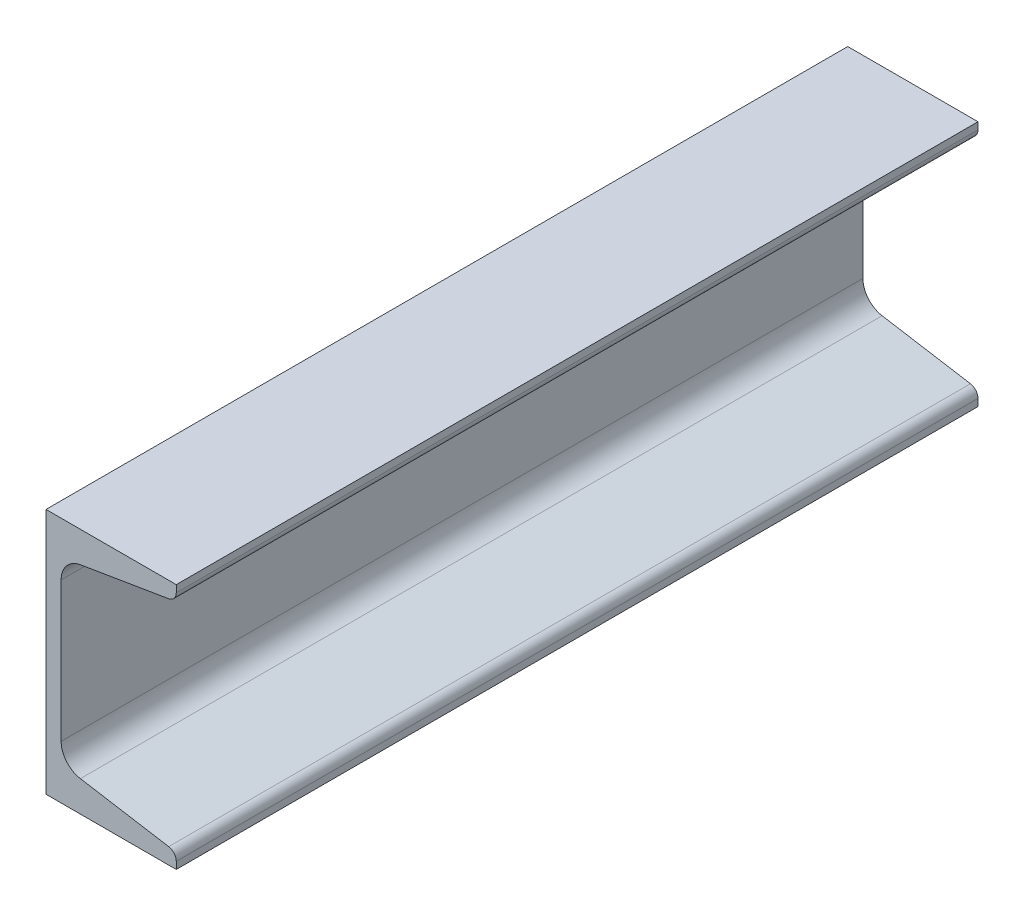
ISO-10303-21;
HEADER;
FILE_DESCRIPTION(('STEP AP214'),'2;1');
FILE_NAME('part.step','',(''),(''),'','','');
FILE_SCHEMA(('AUTOMOTIVE_DESIGN { 1 0 10303 214 1 1 1 1 }'));
ENDSEC;
DATA;
#1=APPLICATION_CONTEXT('core data for automotive mechanical design processes');
#2=APPLICATION_PROTOCOL_DEFINITION('international standard','automotive_design',2000,#1);
#3=PRODUCT_CONTEXT('',#1,'mechanical');
#4=PRODUCT('Part','Part','',(#3));
#5=PRODUCT_RELATED_PRODUCT_CATEGORY('part','',(#4));
#6=PRODUCT_DEFINITION_FORMATION('','',#4);
#7=PRODUCT_DEFINITION_CONTEXT('part definition',#1,'design');
#8=PRODUCT_DEFINITION('design','',#6,#7);
#9=PRODUCT_DEFINITION_SHAPE('','',#8);
#10=(LENGTH_UNIT() NAMED_UNIT(*) SI_UNIT(.MILLI.,.METRE.));
#11=(NAMED_UNIT(*) PLANE_ANGLE_UNIT() SI_UNIT($,.RADIAN.));
#12=(NAMED_UNIT(*) SI_UNIT($,.STERADIAN.) SOLID_ANGLE_UNIT());
#13=UNCERTAINTY_MEASURE_WITH_UNIT(LENGTH_MEASURE(1.E-05),#10,'distance_accuracy_value','');
#14=(GEOMETRIC_REPRESENTATION_CONTEXT(3) GLOBAL_UNCERTAINTY_ASSIGNED_CONTEXT((#13)) GLOBAL_UNIT_ASSIGNED_CONTEXT((#10,
#11,#12)) REPRESENTATION_CONTEXT('',''));
#15=CARTESIAN_POINT('',(0.,0.,0.));
#16=DIRECTION('',(0.,0.,1.));
#17=DIRECTION('',(1.,0.,0.));
#18=AXIS2_PLACEMENT_3D('',#15,#16,#17);
#19=CARTESIAN_POINT('',(0.,0.,247.65));
#20=DIRECTION('',(0.,1.,0.));
#21=DIRECTION('',(0.,0.,1.));
#22=AXIS2_PLACEMENT_3D('',#19,#20,#21);
#23=PLANE('',#22);
#24=DIRECTION('',(1.,0.,0.));
#25=VECTOR('',#24,1.);
#26=CARTESIAN_POINT('',(0.,0.,0.));
#27=LINE('',#26,#25);
#28=CARTESIAN_POINT('',(0.,0.,0.));
#29=VERTEX_POINT('',#28);
#30=CARTESIAN_POINT('',(40.2336,0.,0.));
#31=VERTEX_POINT('',#30);
#32=EDGE_CURVE('E156',#29,#31,#27,.T.);
#33=ORIENTED_EDGE('',*,*,#32,.T.);
#34=DIRECTION('',(0.,0.,-1.));
#35=VECTOR('',#34,1.);
#36=CARTESIAN_POINT('',(40.2336,0.,247.65));
#37=LINE('',#36,#35);
#38=CARTESIAN_POINT('',(40.2336,0.,247.65));
#39=VERTEX_POINT('',#38);
#40=EDGE_CURVE('E11',#39,#31,#37,.T.);
#41=ORIENTED_EDGE('',*,*,#40,.F.);
#42=DIRECTION('',(1.,0.,0.));
#43=VECTOR('',#42,1.);
#44=CARTESIAN_POINT('',(0.,0.,247.65));
#45=LINE('',#44,#43);
#46=CARTESIAN_POINT('',(0.,0.,247.65));
#47=VERTEX_POINT('',#46);
#48=EDGE_CURVE('E186',#47,#39,#45,.T.);
#49=ORIENTED_EDGE('',*,*,#48,.F.);
#50=DIRECTION('',(0.,0.,-1.));
#51=VECTOR('',#50,1.);
#52=CARTESIAN_POINT('',(0.,0.,247.65));
#53=LINE('',#52,#51);
#54=EDGE_CURVE('E52',#47,#29,#53,.T.);
#55=ORIENTED_EDGE('',*,*,#54,.T.);
#56=EDGE_LOOP('',(#33,#41,#49,#55));
#57=FACE_BOUND('',#56,.T.);
#58=ADVANCED_FACE('F36',(#57),#23,.F.);
#59=CARTESIAN_POINT('',(40.2336,0.,247.65));
#60=DIRECTION('',(-1.,0.,0.));
#61=DIRECTION('',(0.,0.,1.));
#62=AXIS2_PLACEMENT_3D('',#59,#60,#61);
#63=PLANE('',#62);
#64=DIRECTION('',(0.,1.,0.));
#65=VECTOR('',#64,1.);
#66=CARTESIAN_POINT('',(40.2336,0.,0.));
#67=LINE('',#66,#65);
#68=CARTESIAN_POINT('',(40.2336,2.18800579212265,0.));
#69=VERTEX_POINT('',#68);
#70=EDGE_CURVE('E158',#31,#69,#67,.T.);
#71=ORIENTED_EDGE('',*,*,#70,.T.);
#72=DIRECTION('',(0.,0.,-1.));
#73=VECTOR('',#72,1.);
#74=CARTESIAN_POINT('',(40.2336,2.18800579212265,247.65));
#75=LINE('',#74,#73);
#76=CARTESIAN_POINT('',(40.2336,2.18800579212265,247.65));
#77=VERTEX_POINT('',#76);
#78=EDGE_CURVE('E44',#77,#69,#75,.T.);
#79=ORIENTED_EDGE('',*,*,#78,.F.);
#80=DIRECTION('',(0.,1.,0.));
#81=VECTOR('',#80,1.);
#82=CARTESIAN_POINT('',(40.2336,0.,247.65));
#83=LINE('',#82,#81);
#84=EDGE_CURVE('E102',#39,#77,#83,.T.);
#85=ORIENTED_EDGE('',*,*,#84,.F.);
#86=ORIENTED_EDGE('',*,*,#40,.T.);
#87=EDGE_LOOP('',(#71,#79,#85,#86));
#88=FACE_BOUND('',#87,.T.);
#89=ADVANCED_FACE('F248',(#88),#63,.F.);
#90=CARTESIAN_POINT('',(37.4396,2.18800579212265,247.65));
#91=DIRECTION('',(0.,0.,-1.));
#92=DIRECTION('',(-1.,0.,0.));
#93=AXIS2_PLACEMENT_3D('',#90,#91,#92);
#94=CYLINDRICAL_SURFACE('',#93,2.79400000000003);
#95=CARTESIAN_POINT('',(37.4396,2.18800579212265,0.));
#96=DIRECTION('',(0.,0.,1.));
#97=DIRECTION('',(1.,0.,0.));
#98=AXIS2_PLACEMENT_3D('',#95,#96,#97);
#99=CIRCLE('',#98,2.79400000000003);
#100=CARTESIAN_POINT('',(37.8989633729746,4.94398498137094,0.));
#101=VERTEX_POINT('',#100);
#102=EDGE_CURVE('E160',#69,#101,#99,.T.);
#103=ORIENTED_EDGE('',*,*,#102,.T.);
#104=DIRECTION('',(0.,0.,-1.));
#105=VECTOR('',#104,1.);
#106=CARTESIAN_POINT('',(37.8989633729746,4.94398498137094,247.65));
#107=LINE('',#106,#105);
#108=CARTESIAN_POINT('',(37.8989633729746,4.94398498137094,247.65));
#109=VERTEX_POINT('',#108);
#110=EDGE_CURVE('E201',#109,#101,#107,.T.);
#111=ORIENTED_EDGE('',*,*,#110,.F.);
#112=CARTESIAN_POINT('',(37.4396,2.18800579212265,247.65));
#113=DIRECTION('',(0.,0.,1.));
#114=DIRECTION('',(1.,0.,0.));
#115=AXIS2_PLACEMENT_3D('',#112,#113,#114);
#116=CIRCLE('',#115,2.79400000000003);
#117=EDGE_CURVE('E208',#77,#109,#116,.T.);
#118=ORIENTED_EDGE('',*,*,#117,.F.);
#119=ORIENTED_EDGE('',*,*,#78,.T.);
#120=EDGE_LOOP('',(#103,#111,#118,#119));
#121=FACE_BOUND('',#120,.T.);
#122=ADVANCED_FACE('F206',(#121),#94,.T.);
#123=CARTESIAN_POINT('',(10.616311414246,9.49142535260086,247.65));
#124=DIRECTION('',(0.164410656039627,0.986391978972163,0.));
#125=DIRECTION('',(-0.986391978972163,0.164410656039627,0.));
#126=AXIS2_PLACEMENT_3D('',#123,#124,#125);
#127=PLANE('',#126);
#128=DIRECTION('',(0.986391978972163,-0.164410656039627,0.));
#129=VECTOR('',#128,1.);
#130=CARTESIAN_POINT('',(10.616311414246,9.49142535260086,0.));
#131=LINE('',#130,#129);
#132=CARTESIAN_POINT('',(10.616311414246,9.49142535260087,0.));
#133=VERTEX_POINT('',#132);
#134=EDGE_CURVE('E163',#133,#101,#131,.T.);
#135=ORIENTED_EDGE('',*,*,#134,.F.);
#136=DIRECTION('',(0.,0.,-1.));
#137=VECTOR('',#136,1.);
#138=CARTESIAN_POINT('',(10.616311414246,9.49142535260087,247.65));
#139=LINE('',#138,#137);
#140=CARTESIAN_POINT('',(10.616311414246,9.49142535260087,247.65));
#141=VERTEX_POINT('',#140);
#142=EDGE_CURVE('E199',#141,#133,#139,.T.);
#143=ORIENTED_EDGE('',*,*,#142,.F.);
#144=DIRECTION('',(0.986391978972163,-0.164410656039627,0.));
#145=VECTOR('',#144,1.);
#146=CARTESIAN_POINT('',(10.616311414246,9.49142535260086,247.65));
#147=LINE('',#146,#145);
#148=EDGE_CURVE('E217',#141,#109,#147,.T.);
#149=ORIENTED_EDGE('',*,*,#148,.T.);
#150=ORIENTED_EDGE('',*,*,#110,.T.);
#151=EDGE_LOOP('',(#135,#143,#149,#150));
#152=FACE_BOUND('',#151,.T.);
#153=ADVANCED_FACE('F214',(#152),#127,.T.);
#154=CARTESIAN_POINT('',(11.7856,16.5066451070509,247.65));
#155=DIRECTION('',(0.,0.,-1.));
#156=DIRECTION('',(-1.,0.,0.));
#157=AXIS2_PLACEMENT_3D('',#154,#155,#156);
#158=CYLINDRICAL_SURFACE('',#157,7.11200000000001);
#159=CARTESIAN_POINT('',(11.7856,16.5066451070509,0.));
#160=DIRECTION('',(0.,0.,1.));
#161=DIRECTION('',(1.,0.,0.));
#162=AXIS2_PLACEMENT_3D('',#159,#160,#161);
#163=CIRCLE('',#162,7.11200000000001);
#164=CARTESIAN_POINT('',(4.6736,16.5066451070509,0.));
#165=VERTEX_POINT('',#164);
#166=EDGE_CURVE('E166',#165,#133,#163,.T.);
#167=ORIENTED_EDGE('',*,*,#166,.F.);
#168=DIRECTION('',(0.,0.,-1.));
#169=VECTOR('',#168,1.);
#170=CARTESIAN_POINT('',(4.6736,16.5066451070509,247.65));
#171=LINE('',#170,#169);
#172=CARTESIAN_POINT('',(4.6736,16.5066451070509,247.65));
#173=VERTEX_POINT('',#172);
#174=EDGE_CURVE('E197',#173,#165,#171,.T.);
#175=ORIENTED_EDGE('',*,*,#174,.F.);
#176=CARTESIAN_POINT('',(11.7856,16.5066451070509,247.65));
#177=DIRECTION('',(0.,0.,1.));
#178=DIRECTION('',(1.,0.,0.));
#179=AXIS2_PLACEMENT_3D('',#176,#177,#178);
#180=CIRCLE('',#179,7.11200000000001);
#181=EDGE_CURVE('E220',#173,#141,#180,.T.);
#182=ORIENTED_EDGE('',*,*,#181,.T.);
#183=ORIENTED_EDGE('',*,*,#142,.T.);
#184=EDGE_LOOP('',(#167,#175,#182,#183));
#185=FACE_BOUND('',#184,.T.);
#186=ADVANCED_FACE('F261',(#185),#158,.F.);
#187=CARTESIAN_POINT('',(4.67360000000015,59.6933548929492,247.65));
#188=DIRECTION('',(1.,0.,0.));
#189=DIRECTION('',(0.,1.,0.));
#190=AXIS2_PLACEMENT_3D('',#187,#188,#189);
#191=PLANE('',#190);
#192=DIRECTION('',(0.,-1.,0.));
#193=VECTOR('',#192,1.);
#194=CARTESIAN_POINT('',(4.67360000000015,59.6933548929492,0.));
#195=LINE('',#194,#193);
#196=CARTESIAN_POINT('',(4.67360000000019,59.6933548929492,0.));
#197=VERTEX_POINT('',#196);
#198=EDGE_CURVE('E169',#197,#165,#195,.T.);
#199=ORIENTED_EDGE('',*,*,#198,.F.);
#200=DIRECTION('',(0.,0.,-1.));
#201=VECTOR('',#200,1.);
#202=CARTESIAN_POINT('',(4.67360000000019,59.6933548929492,247.65));
#203=LINE('',#202,#201);
#204=CARTESIAN_POINT('',(4.67360000000019,59.6933548929492,247.65));
#205=VERTEX_POINT('',#204);
#206=EDGE_CURVE('E195',#205,#197,#203,.T.);
#207=ORIENTED_EDGE('',*,*,#206,.F.);
#208=DIRECTION('',(0.,-1.,0.));
#209=VECTOR('',#208,1.);
#210=CARTESIAN_POINT('',(4.67360000000015,59.6933548929492,247.65));
#211=LINE('',#210,#209);
#212=EDGE_CURVE('E222',#205,#173,#211,.T.);
#213=ORIENTED_EDGE('',*,*,#212,.T.);
#214=ORIENTED_EDGE('',*,*,#174,.T.);
#215=EDGE_LOOP('',(#199,#207,#213,#214));
#216=FACE_BOUND('',#215,.T.);
#217=ADVANCED_FACE('F264',(#216),#191,.T.);
#218=CARTESIAN_POINT('',(11.7856000000002,59.6933548929492,247.65));
#219=DIRECTION('',(0.,0.,-1.));
#220=DIRECTION('',(-1.,0.,0.));
#221=AXIS2_PLACEMENT_3D('',#218,#219,#220);
#222=CYLINDRICAL_SURFACE('',#221,7.11199999999998);
#223=CARTESIAN_POINT('',(11.7856000000002,59.6933548929492,0.));
#224=DIRECTION('',(0.,0.,-1.));
#225=DIRECTION('',(-1.,0.,0.));
#226=AXIS2_PLACEMENT_3D('',#223,#224,#225);
#227=CIRCLE('',#226,7.11199999999998);
#228=CARTESIAN_POINT('',(10.6163114142463,66.7085746473992,0.));
#229=VERTEX_POINT('',#228);
#230=EDGE_CURVE('E172',#197,#229,#227,.T.);
#231=ORIENTED_EDGE('',*,*,#230,.T.);
#232=DIRECTION('',(0.,0.,-1.));
#233=VECTOR('',#232,1.);
#234=CARTESIAN_POINT('',(10.6163114142463,66.7085746473992,247.65));
#235=LINE('',#234,#233);
#236=CARTESIAN_POINT('',(10.6163114142463,66.7085746473992,247.65));
#237=VERTEX_POINT('',#236);
#238=EDGE_CURVE('E192',#237,#229,#235,.T.);
#239=ORIENTED_EDGE('',*,*,#238,.F.);
#240=CARTESIAN_POINT('',(11.7856000000002,59.6933548929492,247.65));
#241=DIRECTION('',(0.,0.,-1.));
#242=DIRECTION('',(-1.,0.,0.));
#243=AXIS2_PLACEMENT_3D('',#240,#241,#242);
#244=CIRCLE('',#243,7.11199999999998);
#245=EDGE_CURVE('E229',#205,#237,#244,.T.);
#246=ORIENTED_EDGE('',*,*,#245,.F.);
#247=ORIENTED_EDGE('',*,*,#206,.T.);
#248=EDGE_LOOP('',(#231,#239,#246,#247));
#249=FACE_BOUND('',#248,.T.);
#250=ADVANCED_FACE('F268',(#249),#222,.F.);
#251=CARTESIAN_POINT('',(10.6163114142463,66.7085746473992,247.65));
#252=DIRECTION('',(-0.164410656039622,0.986391978972163,0.));
#253=DIRECTION('',(-0.986391978972164,-0.164410656039622,0.));
#254=AXIS2_PLACEMENT_3D('',#251,#252,#253);
#255=PLANE('',#254);
#256=DIRECTION('',(0.986391978972164,0.164410656039622,0.));
#257=VECTOR('',#256,1.);
#258=CARTESIAN_POINT('',(10.6163114142463,66.7085746473992,0.));
#259=LINE('',#258,#257);
#260=CARTESIAN_POINT('',(37.8989633729749,71.2560150186291,0.));
#261=VERTEX_POINT('',#260);
#262=EDGE_CURVE('E174',#229,#261,#259,.T.);
#263=ORIENTED_EDGE('',*,*,#262,.T.);
#264=DIRECTION('',(0.,0.,-1.));
#265=VECTOR('',#264,1.);
#266=CARTESIAN_POINT('',(37.8989633729749,71.2560150186291,247.65));
#267=LINE('',#266,#265);
#268=CARTESIAN_POINT('',(37.8989633729749,71.2560150186291,247.65));
#269=VERTEX_POINT('',#268);
#270=EDGE_CURVE('E190',#269,#261,#267,.T.);
#271=ORIENTED_EDGE('',*,*,#270,.F.);
#272=DIRECTION('',(0.986391978972164,0.164410656039622,0.));
#273=VECTOR('',#272,1.);
#274=CARTESIAN_POINT('',(10.6163114142463,66.7085746473992,247.65));
#275=LINE('',#274,#273);
#276=EDGE_CURVE('E231',#237,#269,#275,.T.);
#277=ORIENTED_EDGE('',*,*,#276,.F.);
#278=ORIENTED_EDGE('',*,*,#238,.T.);
#279=EDGE_LOOP('',(#263,#271,#277,#278));
#280=FACE_BOUND('',#279,.T.);
#281=ADVANCED_FACE('F272',(#280),#255,.F.);
#282=CARTESIAN_POINT('',(37.4396000000002,74.0119942078774,247.65));
#283=DIRECTION('',(0.,0.,-1.));
#284=DIRECTION('',(-1.,0.,0.));
#285=AXIS2_PLACEMENT_3D('',#282,#283,#284);
#286=CYLINDRICAL_SURFACE('',#285,2.79400000000009);
#287=CARTESIAN_POINT('',(37.4396000000002,74.0119942078774,0.));
#288=DIRECTION('',(0.,0.,-1.));
#289=DIRECTION('',(-1.,0.,0.));
#290=AXIS2_PLACEMENT_3D('',#287,#288,#289);
#291=CIRCLE('',#290,2.79400000000009);
#292=CARTESIAN_POINT('',(40.2336000000002,74.0119942078774,0.));
#293=VERTEX_POINT('',#292);
#294=EDGE_CURVE('E177',#293,#261,#291,.T.);
#295=ORIENTED_EDGE('',*,*,#294,.F.);
#296=DIRECTION('',(0.,0.,-1.));
#297=VECTOR('',#296,1.);
#298=CARTESIAN_POINT('',(40.2336000000002,74.0119942078774,247.65));
#299=LINE('',#298,#297);
#300=CARTESIAN_POINT('',(40.2336000000002,74.0119942078774,247.65));
#301=VERTEX_POINT('',#300);
#302=EDGE_CURVE('E139',#301,#293,#299,.T.);
#303=ORIENTED_EDGE('',*,*,#302,.F.);
#304=CARTESIAN_POINT('',(37.4396000000002,74.0119942078774,247.65));
#305=DIRECTION('',(0.,0.,-1.));
#306=DIRECTION('',(-1.,0.,0.));
#307=AXIS2_PLACEMENT_3D('',#304,#305,#306);
#308=CIRCLE('',#307,2.79400000000009);
#309=EDGE_CURVE('E148',#301,#269,#308,.T.);
#310=ORIENTED_EDGE('',*,*,#309,.T.);
#311=ORIENTED_EDGE('',*,*,#270,.T.);
#312=EDGE_LOOP('',(#295,#303,#310,#311));
#313=FACE_BOUND('',#312,.T.);
#314=ADVANCED_FACE('F234',(#313),#286,.T.);
#315=CARTESIAN_POINT('',(40.2336000000002,76.2,247.65));
#316=DIRECTION('',(1.,0.,0.));
#317=DIRECTION('',(0.,0.,-1.));
#318=AXIS2_PLACEMENT_3D('',#315,#316,#317);
#319=PLANE('',#318);
#320=DIRECTION('',(0.,-1.,0.));
#321=VECTOR('',#320,1.);
#322=CARTESIAN_POINT('',(40.2336000000002,76.2,0.));
#323=LINE('',#322,#321);
#324=CARTESIAN_POINT('',(40.2336000000002,76.2,0.));
#325=VERTEX_POINT('',#324);
#326=EDGE_CURVE('E135',#325,#293,#323,.T.);
#327=ORIENTED_EDGE('',*,*,#326,.F.);
#328=DIRECTION('',(0.,0.,-1.));
#329=VECTOR('',#328,1.);
#330=CARTESIAN_POINT('',(40.2336000000002,76.2,247.65));
#331=LINE('',#330,#329);
#332=CARTESIAN_POINT('',(40.2336000000002,76.2,247.65));
#333=VERTEX_POINT('',#332);
#334=EDGE_CURVE('E130',#333,#325,#331,.T.);
#335=ORIENTED_EDGE('',*,*,#334,.F.);
#336=DIRECTION('',(0.,-1.,0.));
#337=VECTOR('',#336,1.);
#338=CARTESIAN_POINT('',(40.2336000000002,76.2,247.65));
#339=LINE('',#338,#337);
#340=EDGE_CURVE('E133',#333,#301,#339,.T.);
#341=ORIENTED_EDGE('',*,*,#340,.T.);
#342=ORIENTED_EDGE('',*,*,#302,.T.);
#343=EDGE_LOOP('',(#327,#335,#341,#342));
#344=FACE_BOUND('',#343,.T.);
#345=ADVANCED_FACE('F132',(#344),#319,.T.);
#346=CARTESIAN_POINT('',(0.,76.2,247.65));
#347=DIRECTION('',(0.,1.,0.));
#348=DIRECTION('',(0.,0.,1.));
#349=AXIS2_PLACEMENT_3D('',#346,#347,#348);
#350=PLANE('',#349);
#351=DIRECTION('',(1.,0.,0.));
#352=VECTOR('',#351,1.);
#353=CARTESIAN_POINT('',(0.,76.2,0.));
#354=LINE('',#353,#352);
#355=CARTESIAN_POINT('',(0.,76.2,0.));
#356=VERTEX_POINT('',#355);
#357=EDGE_CURVE('E181',#356,#325,#354,.T.);
#358=ORIENTED_EDGE('',*,*,#357,.F.);
#359=DIRECTION('',(0.,0.,-1.));
#360=VECTOR('',#359,1.);
#361=CARTESIAN_POINT('',(0.,76.2,247.65));
#362=LINE('',#361,#360);
#363=CARTESIAN_POINT('',(0.,76.2,247.65));
#364=VERTEX_POINT('',#363);
#365=EDGE_CURVE('E90',#364,#356,#362,.T.);
#366=ORIENTED_EDGE('',*,*,#365,.F.);
#367=DIRECTION('',(1.,0.,0.));
#368=VECTOR('',#367,1.);
#369=CARTESIAN_POINT('',(0.,76.2,247.65));
#370=LINE('',#369,#368);
#371=EDGE_CURVE('E146',#364,#333,#370,.T.);
#372=ORIENTED_EDGE('',*,*,#371,.T.);
#373=ORIENTED_EDGE('',*,*,#334,.T.);
#374=EDGE_LOOP('',(#358,#366,#372,#373));
#375=FACE_BOUND('',#374,.T.);
#376=ADVANCED_FACE('F150',(#375),#350,.T.);
#377=CARTESIAN_POINT('',(0.,0.,247.65));
#378=DIRECTION('',(-1.,0.,0.));
#379=DIRECTION('',(0.,0.,1.));
#380=AXIS2_PLACEMENT_3D('',#377,#378,#379);
#381=PLANE('',#380);
#382=DIRECTION('',(0.,1.,0.));
#383=VECTOR('',#382,1.);
#384=CARTESIAN_POINT('',(0.,0.,0.));
#385=LINE('',#384,#383);
#386=EDGE_CURVE('E183',#29,#356,#385,.T.);
#387=ORIENTED_EDGE('',*,*,#386,.F.);
#388=ORIENTED_EDGE('',*,*,#54,.F.);
#389=DIRECTION('',(0.,1.,0.));
#390=VECTOR('',#389,1.);
#391=CARTESIAN_POINT('',(0.,0.,247.65));
#392=LINE('',#391,#390);
#393=EDGE_CURVE('E151',#47,#364,#392,.T.);
#394=ORIENTED_EDGE('',*,*,#393,.T.);
#395=ORIENTED_EDGE('',*,*,#365,.T.);
#396=EDGE_LOOP('',(#387,#388,#394,#395));
#397=FACE_BOUND('',#396,.T.);
#398=ADVANCED_FACE('F237',(#397),#381,.T.);
#399=CARTESIAN_POINT('',(37.4396,2.18800579212265,247.65));
#400=DIRECTION('',(0.,0.,1.));
#401=DIRECTION('',(1.,0.,0.));
#402=AXIS2_PLACEMENT_3D('',#399,#400,#401);
#403=PLANE('',#402);
#404=ORIENTED_EDGE('',*,*,#48,.T.);
#405=ORIENTED_EDGE('',*,*,#84,.T.);
#406=ORIENTED_EDGE('',*,*,#117,.T.);
#407=ORIENTED_EDGE('',*,*,#148,.F.);
#408=ORIENTED_EDGE('',*,*,#181,.F.);
#409=ORIENTED_EDGE('',*,*,#212,.F.);
#410=ORIENTED_EDGE('',*,*,#245,.T.);
#411=ORIENTED_EDGE('',*,*,#276,.T.);
#412=ORIENTED_EDGE('',*,*,#309,.F.);
#413=ORIENTED_EDGE('',*,*,#340,.F.);
#414=ORIENTED_EDGE('',*,*,#371,.F.);
#415=ORIENTED_EDGE('',*,*,#393,.F.);
#416=EDGE_LOOP('',(#404,#405,#406,#407,#408,#409,#410,#411,#412,#413,#414,#415));
#417=FACE_BOUND('',#416,.T.);
#418=ADVANCED_FACE('F144',(#417),#403,.T.);
#419=CARTESIAN_POINT('',(37.4396,2.18800579212265,0.));
#420=DIRECTION('',(0.,0.,1.));
#421=DIRECTION('',(1.,0.,0.));
#422=AXIS2_PLACEMENT_3D('',#419,#420,#421);
#423=PLANE('',#422);
#424=ORIENTED_EDGE('',*,*,#32,.F.);
#425=ORIENTED_EDGE('',*,*,#386,.T.);
#426=ORIENTED_EDGE('',*,*,#357,.T.);
#427=ORIENTED_EDGE('',*,*,#326,.T.);
#428=ORIENTED_EDGE('',*,*,#294,.T.);
#429=ORIENTED_EDGE('',*,*,#262,.F.);
#430=ORIENTED_EDGE('',*,*,#230,.F.);
#431=ORIENTED_EDGE('',*,*,#198,.T.);
#432=ORIENTED_EDGE('',*,*,#166,.T.);
#433=ORIENTED_EDGE('',*,*,#134,.T.);
#434=ORIENTED_EDGE('',*,*,#102,.F.);
#435=ORIENTED_EDGE('',*,*,#70,.F.);
#436=EDGE_LOOP('',(#424,#425,#426,#427,#428,#429,#430,#431,#432,#433,#434,#435));
#437=FACE_BOUND('',#436,.T.);
#438=ADVANCED_FACE('F210',(#437),#423,.F.);
#439=CLOSED_SHELL('',(#58,#89,#122,#153,#186,#217,#250,#281,#314,#345,#376,#398,#418,#438));
#440=MANIFOLD_SOLID_BREP('B2',#439);
#441=ADVANCED_BREP_SHAPE_REPRESENTATION('',(#18,#440),#14);
#442=SHAPE_DEFINITION_REPRESENTATION(#9,#441);
ENDSEC;
END-ISO-10303-21;
